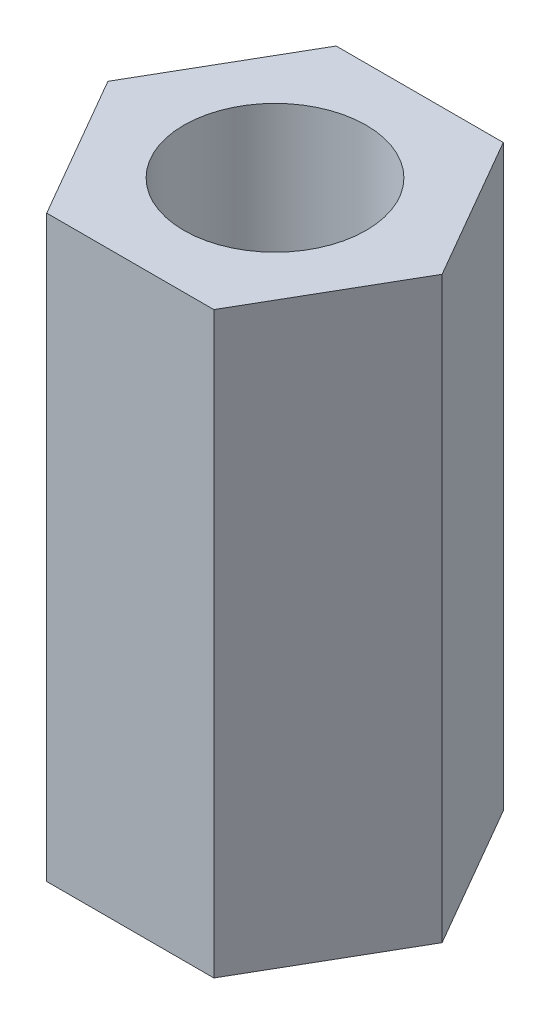
ISO-10303-21;
HEADER;
FILE_DESCRIPTION(('STEP AP214'),'2;1');
FILE_NAME('part.step','',(''),(''),'','','');
FILE_SCHEMA(('AUTOMOTIVE_DESIGN { 1 0 10303 214 1 1 1 1 }'));
ENDSEC;
DATA;
#1=APPLICATION_CONTEXT('core data for automotive mechanical design processes');
#2=APPLICATION_PROTOCOL_DEFINITION('international standard','automotive_design',2000,#1);
#3=PRODUCT_CONTEXT('',#1,'mechanical');
#4=PRODUCT('Part','Part','',(#3));
#5=PRODUCT_RELATED_PRODUCT_CATEGORY('part','',(#4));
#6=PRODUCT_DEFINITION_FORMATION('','',#4);
#7=PRODUCT_DEFINITION_CONTEXT('part definition',#1,'design');
#8=PRODUCT_DEFINITION('design','',#6,#7);
#9=PRODUCT_DEFINITION_SHAPE('','',#8);
#10=(LENGTH_UNIT() NAMED_UNIT(*) SI_UNIT(.MILLI.,.METRE.));
#11=(NAMED_UNIT(*) PLANE_ANGLE_UNIT() SI_UNIT($,.RADIAN.));
#12=(NAMED_UNIT(*) SI_UNIT($,.STERADIAN.) SOLID_ANGLE_UNIT());
#13=UNCERTAINTY_MEASURE_WITH_UNIT(LENGTH_MEASURE(1.E-05),#10,'distance_accuracy_value','');
#14=(GEOMETRIC_REPRESENTATION_CONTEXT(3) GLOBAL_UNCERTAINTY_ASSIGNED_CONTEXT((#13)) GLOBAL_UNIT_ASSIGNED_CONTEXT((#10,
#11,#12)) REPRESENTATION_CONTEXT('',''));
#15=CARTESIAN_POINT('',(0.,0.,0.));
#16=DIRECTION('',(0.,0.,1.));
#17=DIRECTION('',(1.,0.,0.));
#18=AXIS2_PLACEMENT_3D('',#15,#16,#17);
#19=CARTESIAN_POINT('',(1.44337567297409,10.,2.49999999999998));
#20=DIRECTION('',(-0.866025403784442,0.,-0.499999999999995));
#21=DIRECTION('',(-0.499999999999995,0.,0.866025403784442));
#22=AXIS2_PLACEMENT_3D('',#19,#20,#21);
#23=PLANE('',#22);
#24=DIRECTION('',(0.499999999999995,0.,-0.866025403784442));
#25=VECTOR('',#24,1.);
#26=CARTESIAN_POINT('',(1.44337567297409,0.,2.49999999999998));
#27=LINE('',#26,#25);
#28=CARTESIAN_POINT('',(1.44337567297409,0.,2.49999999999998));
#29=VERTEX_POINT('',#28);
#30=CARTESIAN_POINT('',(2.88675134594812,0.,0.));
#31=VERTEX_POINT('',#30);
#32=EDGE_CURVE('E122',#29,#31,#27,.T.);
#33=ORIENTED_EDGE('',*,*,#32,.T.);
#34=DIRECTION('',(0.,-1.,0.));
#35=VECTOR('',#34,1.);
#36=CARTESIAN_POINT('',(2.88675134594812,10.,0.));
#37=LINE('',#36,#35);
#38=CARTESIAN_POINT('',(2.88675134594812,10.,0.));
#39=VERTEX_POINT('',#38);
#40=EDGE_CURVE('E11',#39,#31,#37,.T.);
#41=ORIENTED_EDGE('',*,*,#40,.F.);
#42=DIRECTION('',(0.499999999999995,0.,-0.866025403784442));
#43=VECTOR('',#42,1.);
#44=CARTESIAN_POINT('',(1.44337567297409,10.,2.49999999999998));
#45=LINE('',#44,#43);
#46=CARTESIAN_POINT('',(1.44337567297409,10.,2.49999999999998));
#47=VERTEX_POINT('',#46);
#48=EDGE_CURVE('E133',#47,#39,#45,.T.);
#49=ORIENTED_EDGE('',*,*,#48,.F.);
#50=DIRECTION('',(0.,-1.,0.));
#51=VECTOR('',#50,1.);
#52=CARTESIAN_POINT('',(1.44337567297409,10.,2.49999999999998));
#53=LINE('',#52,#51);
#54=EDGE_CURVE('E118',#47,#29,#53,.T.);
#55=ORIENTED_EDGE('',*,*,#54,.T.);
#56=EDGE_LOOP('',(#33,#41,#49,#55));
#57=FACE_BOUND('',#56,.T.);
#58=ADVANCED_FACE('F35',(#57),#23,.F.);
#59=CARTESIAN_POINT('',(2.88675134594812,10.,0.));
#60=DIRECTION('',(-0.866025403784438,0.,0.500000000000001));
#61=DIRECTION('',(0.500000000000001,0.,0.866025403784438));
#62=AXIS2_PLACEMENT_3D('',#59,#60,#61);
#63=PLANE('',#62);
#64=DIRECTION('',(-0.500000000000001,0.,-0.866025403784438));
#65=VECTOR('',#64,1.);
#66=CARTESIAN_POINT('',(2.88675134594812,0.,0.));
#67=LINE('',#66,#65);
#68=CARTESIAN_POINT('',(1.44337567297405,0.,-2.5));
#69=VERTEX_POINT('',#68);
#70=EDGE_CURVE('E125',#31,#69,#67,.T.);
#71=ORIENTED_EDGE('',*,*,#70,.T.);
#72=DIRECTION('',(0.,-1.,0.));
#73=VECTOR('',#72,1.);
#74=CARTESIAN_POINT('',(1.44337567297405,10.,-2.5));
#75=LINE('',#74,#73);
#76=CARTESIAN_POINT('',(1.44337567297405,10.,-2.5));
#77=VERTEX_POINT('',#76);
#78=EDGE_CURVE('E43',#77,#69,#75,.T.);
#79=ORIENTED_EDGE('',*,*,#78,.F.);
#80=DIRECTION('',(-0.500000000000001,0.,-0.866025403784438));
#81=VECTOR('',#80,1.);
#82=CARTESIAN_POINT('',(2.88675134594812,10.,0.));
#83=LINE('',#82,#81);
#84=EDGE_CURVE('E89',#39,#77,#83,.T.);
#85=ORIENTED_EDGE('',*,*,#84,.F.);
#86=ORIENTED_EDGE('',*,*,#40,.T.);
#87=EDGE_LOOP('',(#71,#79,#85,#86));
#88=FACE_BOUND('',#87,.T.);
#89=ADVANCED_FACE('F158',(#88),#63,.F.);
#90=CARTESIAN_POINT('',(1.44337567297405,10.,-2.5));
#91=DIRECTION('',(0.,0.,1.));
#92=DIRECTION('',(1.,0.,0.));
#93=AXIS2_PLACEMENT_3D('',#90,#91,#92);
#94=PLANE('',#93);
#95=DIRECTION('',(-1.,0.,0.));
#96=VECTOR('',#95,1.);
#97=CARTESIAN_POINT('',(1.44337567297405,0.,-2.5));
#98=LINE('',#97,#96);
#99=CARTESIAN_POINT('',(-1.44337567297407,0.,-2.49999999999999));
#100=VERTEX_POINT('',#99);
#101=EDGE_CURVE('E128',#69,#100,#98,.T.);
#102=ORIENTED_EDGE('',*,*,#101,.T.);
#103=DIRECTION('',(0.,-1.,0.));
#104=VECTOR('',#103,1.);
#105=CARTESIAN_POINT('',(-1.44337567297407,10.,-2.49999999999999));
#106=LINE('',#105,#104);
#107=CARTESIAN_POINT('',(-1.44337567297407,10.,-2.49999999999999));
#108=VERTEX_POINT('',#107);
#109=EDGE_CURVE('E113',#108,#100,#106,.T.);
#110=ORIENTED_EDGE('',*,*,#109,.F.);
#111=DIRECTION('',(-1.,0.,0.));
#112=VECTOR('',#111,1.);
#113=CARTESIAN_POINT('',(1.44337567297405,10.,-2.5));
#114=LINE('',#113,#112);
#115=EDGE_CURVE('E104',#77,#108,#114,.T.);
#116=ORIENTED_EDGE('',*,*,#115,.F.);
#117=ORIENTED_EDGE('',*,*,#78,.T.);
#118=EDGE_LOOP('',(#102,#110,#116,#117));
#119=FACE_BOUND('',#118,.T.);
#120=ADVANCED_FACE('F139',(#119),#94,.F.);
#121=CARTESIAN_POINT('',(-1.44337567297407,10.,-2.49999999999999));
#122=DIRECTION('',(0.866025403784442,0.,0.499999999999995));
#123=DIRECTION('',(0.499999999999995,0.,-0.866025403784442));
#124=AXIS2_PLACEMENT_3D('',#121,#122,#123);
#125=PLANE('',#124);
#126=DIRECTION('',(-0.499999999999995,0.,0.866025403784442));
#127=VECTOR('',#126,1.);
#128=CARTESIAN_POINT('',(-1.44337567297407,0.,-2.49999999999999));
#129=LINE('',#128,#127);
#130=CARTESIAN_POINT('',(-2.88675134594812,0.,0.));
#131=VERTEX_POINT('',#130);
#132=EDGE_CURVE('E112',#100,#131,#129,.T.);
#133=ORIENTED_EDGE('',*,*,#132,.T.);
#134=DIRECTION('',(0.,-1.,0.));
#135=VECTOR('',#134,1.);
#136=CARTESIAN_POINT('',(-2.88675134594812,10.,0.));
#137=LINE('',#136,#135);
#138=CARTESIAN_POINT('',(-2.88675134594812,10.,0.));
#139=VERTEX_POINT('',#138);
#140=EDGE_CURVE('E109',#139,#131,#137,.T.);
#141=ORIENTED_EDGE('',*,*,#140,.F.);
#142=DIRECTION('',(-0.499999999999995,0.,0.866025403784442));
#143=VECTOR('',#142,1.);
#144=CARTESIAN_POINT('',(-1.44337567297407,10.,-2.49999999999999));
#145=LINE('',#144,#143);
#146=EDGE_CURVE('E98',#108,#139,#145,.T.);
#147=ORIENTED_EDGE('',*,*,#146,.F.);
#148=ORIENTED_EDGE('',*,*,#109,.T.);
#149=EDGE_LOOP('',(#133,#141,#147,#148));
#150=FACE_BOUND('',#149,.T.);
#151=ADVANCED_FACE('F110',(#150),#125,.F.);
#152=CARTESIAN_POINT('',(-2.88675134594812,10.,0.));
#153=DIRECTION('',(0.866025403784435,0.,-0.500000000000007));
#154=DIRECTION('',(-0.500000000000007,0.,-0.866025403784435));
#155=AXIS2_PLACEMENT_3D('',#152,#153,#154);
#156=PLANE('',#155);
#157=DIRECTION('',(0.500000000000007,0.,0.866025403784435));
#158=VECTOR('',#157,1.);
#159=CARTESIAN_POINT('',(-2.88675134594812,0.,0.));
#160=LINE('',#159,#158);
#161=CARTESIAN_POINT('',(-1.44337567297404,0.,2.50000000000001));
#162=VERTEX_POINT('',#161);
#163=EDGE_CURVE('E75',#131,#162,#160,.T.);
#164=ORIENTED_EDGE('',*,*,#163,.T.);
#165=DIRECTION('',(0.,-1.,0.));
#166=VECTOR('',#165,1.);
#167=CARTESIAN_POINT('',(-1.44337567297404,10.,2.50000000000001));
#168=LINE('',#167,#166);
#169=CARTESIAN_POINT('',(-1.44337567297404,10.,2.50000000000001));
#170=VERTEX_POINT('',#169);
#171=EDGE_CURVE('E114',#170,#162,#168,.T.);
#172=ORIENTED_EDGE('',*,*,#171,.F.);
#173=DIRECTION('',(0.500000000000007,0.,0.866025403784435));
#174=VECTOR('',#173,1.);
#175=CARTESIAN_POINT('',(-2.88675134594812,10.,0.));
#176=LINE('',#175,#174);
#177=EDGE_CURVE('E102',#139,#170,#176,.T.);
#178=ORIENTED_EDGE('',*,*,#177,.F.);
#179=ORIENTED_EDGE('',*,*,#140,.T.);
#180=EDGE_LOOP('',(#164,#172,#178,#179));
#181=FACE_BOUND('',#180,.T.);
#182=ADVANCED_FACE('F116',(#181),#156,.F.);
#183=CARTESIAN_POINT('',(-1.44337567297404,10.,2.50000000000001));
#184=DIRECTION('',(0.,0.,-1.));
#185=DIRECTION('',(-1.,0.,0.));
#186=AXIS2_PLACEMENT_3D('',#183,#184,#185);
#187=PLANE('',#186);
#188=DIRECTION('',(1.,0.,0.));
#189=VECTOR('',#188,1.);
#190=CARTESIAN_POINT('',(-1.44337567297404,0.,2.50000000000001));
#191=LINE('',#190,#189);
#192=EDGE_CURVE('E81',#162,#29,#191,.T.);
#193=ORIENTED_EDGE('',*,*,#192,.T.);
#194=ORIENTED_EDGE('',*,*,#54,.F.);
#195=DIRECTION('',(1.,0.,0.));
#196=VECTOR('',#195,1.);
#197=CARTESIAN_POINT('',(-1.44337567297404,10.,2.50000000000001));
#198=LINE('',#197,#196);
#199=EDGE_CURVE('E51',#170,#47,#198,.T.);
#200=ORIENTED_EDGE('',*,*,#199,.F.);
#201=ORIENTED_EDGE('',*,*,#171,.T.);
#202=EDGE_LOOP('',(#193,#194,#200,#201));
#203=FACE_BOUND('',#202,.T.);
#204=ADVANCED_FACE('F146',(#203),#187,.F.);
#205=CARTESIAN_POINT('',(0.,10.,0.));
#206=DIRECTION('',(0.,1.,0.));
#207=DIRECTION('',(0.,0.,1.));
#208=AXIS2_PLACEMENT_3D('',#205,#206,#207);
#209=PLANE('',#208);
#210=CARTESIAN_POINT('',(0.,10.,0.));
#211=DIRECTION('',(0.,1.,0.));
#212=DIRECTION('',(0.,0.,1.));
#213=AXIS2_PLACEMENT_3D('',#210,#211,#212);
#214=CIRCLE('',#213,1.575);
#215=CARTESIAN_POINT('',(0.,10.,1.575));
#216=VERTEX_POINT('',#215);
#217=EDGE_CURVE('E246',#216,#216,#214,.T.);
#218=ORIENTED_EDGE('',*,*,#217,.F.);
#219=EDGE_LOOP('',(#218));
#220=FACE_BOUND('',#219,.T.);
#221=ORIENTED_EDGE('',*,*,#48,.T.);
#222=ORIENTED_EDGE('',*,*,#84,.T.);
#223=ORIENTED_EDGE('',*,*,#115,.T.);
#224=ORIENTED_EDGE('',*,*,#146,.T.);
#225=ORIENTED_EDGE('',*,*,#177,.T.);
#226=ORIENTED_EDGE('',*,*,#199,.T.);
#227=EDGE_LOOP('',(#221,#222,#223,#224,#225,#226));
#228=FACE_BOUND('',#227,.T.);
#229=ADVANCED_FACE('F100',(#220,#228),#209,.T.);
#230=CARTESIAN_POINT('',(0.,0.,0.));
#231=DIRECTION('',(0.,1.,0.));
#232=DIRECTION('',(0.,0.,1.));
#233=AXIS2_PLACEMENT_3D('',#230,#231,#232);
#234=PLANE('',#233);
#235=CARTESIAN_POINT('',(0.,0.,0.));
#236=DIRECTION('',(0.,-1.,0.));
#237=DIRECTION('',(0.,0.,-1.));
#238=AXIS2_PLACEMENT_3D('',#235,#236,#237);
#239=CIRCLE('',#238,1.57499999999999);
#240=CARTESIAN_POINT('',(0.,0.,-1.57499999999999));
#241=VERTEX_POINT('',#240);
#242=EDGE_CURVE('E244',#241,#241,#239,.T.);
#243=ORIENTED_EDGE('',*,*,#242,.F.);
#244=EDGE_LOOP('',(#243));
#245=FACE_BOUND('',#244,.T.);
#246=ORIENTED_EDGE('',*,*,#32,.F.);
#247=ORIENTED_EDGE('',*,*,#192,.F.);
#248=ORIENTED_EDGE('',*,*,#163,.F.);
#249=ORIENTED_EDGE('',*,*,#132,.F.);
#250=ORIENTED_EDGE('',*,*,#101,.F.);
#251=ORIENTED_EDGE('',*,*,#70,.F.);
#252=EDGE_LOOP('',(#246,#247,#248,#249,#250,#251));
#253=FACE_BOUND('',#252,.T.);
#254=ADVANCED_FACE('F142',(#245,#253),#234,.F.);
#255=CARTESIAN_POINT('',(0.,6.,0.));
#256=DIRECTION('',(0.,1.,0.));
#257=DIRECTION('',(0.,0.,1.));
#258=AXIS2_PLACEMENT_3D('',#255,#256,#257);
#259=CONICAL_SURFACE('',#258,1.575,1.02974425867665);
#260=CARTESIAN_POINT('',(0.,5.05364452503159,0.));
#261=VERTEX_POINT('',#260);
#262=VERTEX_LOOP('',#261);
#263=FACE_BOUND('',#262,.T.);
#264=CARTESIAN_POINT('',(0.,6.,0.));
#265=DIRECTION('',(0.,1.,0.));
#266=DIRECTION('',(0.,0.,1.));
#267=AXIS2_PLACEMENT_3D('',#264,#265,#266);
#268=CIRCLE('',#267,1.575);
#269=CARTESIAN_POINT('',(0.,6.,1.575));
#270=VERTEX_POINT('',#269);
#271=EDGE_CURVE('E126',#270,#270,#268,.T.);
#272=ORIENTED_EDGE('',*,*,#271,.T.);
#273=EDGE_LOOP('',(#272));
#274=FACE_BOUND('',#273,.T.);
#275=ADVANCED_FACE('F193',(#263,#274),#259,.F.);
#276=CARTESIAN_POINT('',(0.,10.,0.));
#277=DIRECTION('',(0.,1.,0.));
#278=DIRECTION('',(0.,0.,1.));
#279=AXIS2_PLACEMENT_3D('',#276,#277,#278);
#280=CYLINDRICAL_SURFACE('',#279,1.575);
#281=ORIENTED_EDGE('',*,*,#271,.F.);
#282=EDGE_LOOP('',(#281));
#283=FACE_BOUND('',#282,.T.);
#284=ORIENTED_EDGE('',*,*,#217,.T.);
#285=EDGE_LOOP('',(#284));
#286=FACE_BOUND('',#285,.T.);
#287=ADVANCED_FACE('F198',(#283,#286),#280,.F.);
#288=CARTESIAN_POINT('',(0.,4.,0.));
#289=DIRECTION('',(0.,-1.,0.));
#290=DIRECTION('',(0.,0.,-1.));
#291=AXIS2_PLACEMENT_3D('',#288,#289,#290);
#292=CONICAL_SURFACE('',#291,1.575,1.02974425867665);
#293=CARTESIAN_POINT('',(0.,4.94635547496841,0.));
#294=VERTEX_POINT('',#293);
#295=VERTEX_LOOP('',#294);
#296=FACE_BOUND('',#295,.T.);
#297=CARTESIAN_POINT('',(0.,4.,0.));
#298=DIRECTION('',(0.,-1.,0.));
#299=DIRECTION('',(0.,0.,-1.));
#300=AXIS2_PLACEMENT_3D('',#297,#298,#299);
#301=CIRCLE('',#300,1.575);
#302=CARTESIAN_POINT('',(0.,4.,-1.575));
#303=VERTEX_POINT('',#302);
#304=EDGE_CURVE('E241',#303,#303,#301,.T.);
#305=ORIENTED_EDGE('',*,*,#304,.T.);
#306=EDGE_LOOP('',(#305));
#307=FACE_BOUND('',#306,.T.);
#308=ADVANCED_FACE('F208',(#296,#307),#292,.F.);
#309=CARTESIAN_POINT('',(0.,0.,0.));
#310=DIRECTION('',(0.,-1.,0.));
#311=DIRECTION('',(0.,0.,-1.));
#312=AXIS2_PLACEMENT_3D('',#309,#310,#311);
#313=CYLINDRICAL_SURFACE('',#312,1.57499999999999);
#314=ORIENTED_EDGE('',*,*,#304,.F.);
#315=EDGE_LOOP('',(#314));
#316=FACE_BOUND('',#315,.T.);
#317=ORIENTED_EDGE('',*,*,#242,.T.);
#318=EDGE_LOOP('',(#317));
#319=FACE_BOUND('',#318,.T.);
#320=ADVANCED_FACE('F224',(#316,#319),#313,.F.);
#321=CLOSED_SHELL('',(#58,#89,#120,#151,#182,#204,#229,#254,#275,#287,#308,#320));
#322=MANIFOLD_SOLID_BREP('B2',#321);
#323=ADVANCED_BREP_SHAPE_REPRESENTATION('',(#18,#322),#14);
#324=SHAPE_DEFINITION_REPRESENTATION(#9,#323);
ENDSEC;
END-ISO-10303-21;
